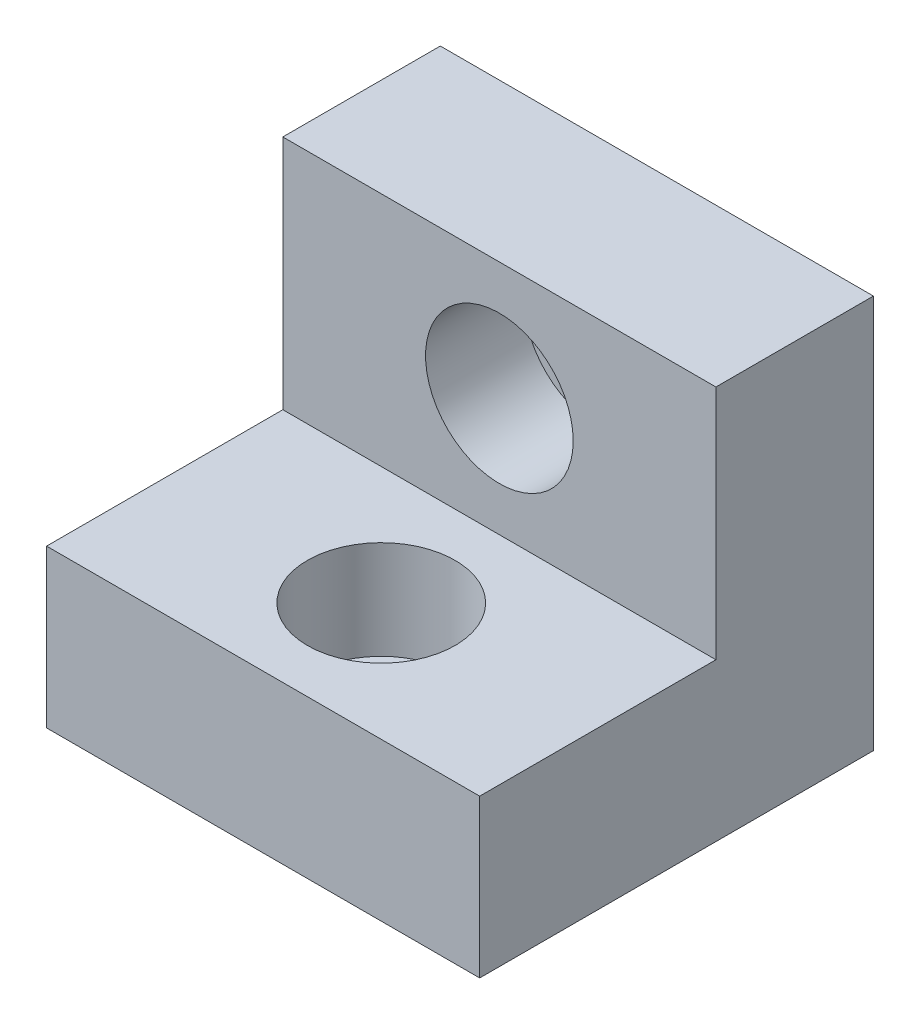
ISO-10303-21;
HEADER;
FILE_DESCRIPTION(('STEP AP214'),'2;1');
FILE_NAME('part.step','',(''),(''),'','','');
FILE_SCHEMA(('AUTOMOTIVE_DESIGN { 1 0 10303 214 1 1 1 1 }'));
ENDSEC;
DATA;
#1=APPLICATION_CONTEXT('core data for automotive mechanical design processes');
#2=APPLICATION_PROTOCOL_DEFINITION('international standard','automotive_design',2000,#1);
#3=PRODUCT_CONTEXT('',#1,'mechanical');
#4=PRODUCT('Part','Part','',(#3));
#5=PRODUCT_RELATED_PRODUCT_CATEGORY('part','',(#4));
#6=PRODUCT_DEFINITION_FORMATION('','',#4);
#7=PRODUCT_DEFINITION_CONTEXT('part definition',#1,'design');
#8=PRODUCT_DEFINITION('design','',#6,#7);
#9=PRODUCT_DEFINITION_SHAPE('','',#8);
#10=(LENGTH_UNIT() NAMED_UNIT(*) SI_UNIT(.MILLI.,.METRE.));
#11=(NAMED_UNIT(*) PLANE_ANGLE_UNIT() SI_UNIT($,.RADIAN.));
#12=(NAMED_UNIT(*) SI_UNIT($,.STERADIAN.) SOLID_ANGLE_UNIT());
#13=UNCERTAINTY_MEASURE_WITH_UNIT(LENGTH_MEASURE(1.E-05),#10,'distance_accuracy_value','');
#14=(GEOMETRIC_REPRESENTATION_CONTEXT(3) GLOBAL_UNCERTAINTY_ASSIGNED_CONTEXT((#13)) GLOBAL_UNIT_ASSIGNED_CONTEXT((#10,
#11,#12)) REPRESENTATION_CONTEXT('',''));
#15=CARTESIAN_POINT('',(0.,0.,0.));
#16=DIRECTION('',(0.,0.,1.));
#17=DIRECTION('',(1.,0.,0.));
#18=AXIS2_PLACEMENT_3D('',#15,#16,#17);
#19=CARTESIAN_POINT('',(22.,12.,0.));
#20=DIRECTION('',(0.,0.,-1.));
#21=DIRECTION('',(0.,1.,0.));
#22=AXIS2_PLACEMENT_3D('',#19,#20,#21);
#23=PLANE('',#22);
#24=CARTESIAN_POINT('',(11.,6.,0.));
#25=DIRECTION('',(0.,0.,1.));
#26=DIRECTION('',(1.,0.,0.));
#27=AXIS2_PLACEMENT_3D('',#24,#25,#26);
#28=CIRCLE('',#27,3.75);
#29=CARTESIAN_POINT('',(14.75,6.,0.));
#30=VERTEX_POINT('',#29);
#31=EDGE_CURVE('E164',#30,#30,#28,.T.);
#32=ORIENTED_EDGE('',*,*,#31,.F.);
#33=EDGE_LOOP('',(#32));
#34=FACE_BOUND('',#33,.T.);
#35=DIRECTION('',(0.,-1.,0.));
#36=VECTOR('',#35,1.);
#37=CARTESIAN_POINT('',(0.,12.,0.));
#38=LINE('',#37,#36);
#39=CARTESIAN_POINT('',(0.,12.,0.));
#40=VERTEX_POINT('',#39);
#41=CARTESIAN_POINT('',(0.,0.,0.));
#42=VERTEX_POINT('',#41);
#43=EDGE_CURVE('E136',#40,#42,#38,.T.);
#44=ORIENTED_EDGE('',*,*,#43,.T.);
#45=DIRECTION('',(-1.,0.,0.));
#46=VECTOR('',#45,1.);
#47=CARTESIAN_POINT('',(22.,0.,0.));
#48=LINE('',#47,#46);
#49=CARTESIAN_POINT('',(22.,0.,0.));
#50=VERTEX_POINT('',#49);
#51=EDGE_CURVE('E11',#50,#42,#48,.T.);
#52=ORIENTED_EDGE('',*,*,#51,.F.);
#53=DIRECTION('',(0.,-1.,0.));
#54=VECTOR('',#53,1.);
#55=CARTESIAN_POINT('',(22.,12.,0.));
#56=LINE('',#55,#54);
#57=CARTESIAN_POINT('',(22.,12.,0.));
#58=VERTEX_POINT('',#57);
#59=EDGE_CURVE('E155',#58,#50,#56,.T.);
#60=ORIENTED_EDGE('',*,*,#59,.F.);
#61=DIRECTION('',(-1.,0.,0.));
#62=VECTOR('',#61,1.);
#63=CARTESIAN_POINT('',(22.,12.,0.));
#64=LINE('',#63,#62);
#65=EDGE_CURVE('E134',#58,#40,#64,.T.);
#66=ORIENTED_EDGE('',*,*,#65,.T.);
#67=EDGE_LOOP('',(#44,#52,#60,#66));
#68=FACE_BOUND('',#67,.T.);
#69=ADVANCED_FACE('F44',(#34,#68),#23,.F.);
#70=CARTESIAN_POINT('',(22.,0.,0.));
#71=DIRECTION('',(0.,-1.,0.));
#72=DIRECTION('',(0.,0.,-1.));
#73=AXIS2_PLACEMENT_3D('',#70,#71,#72);
#74=PLANE('',#73);
#75=CARTESIAN_POINT('',(11.,0.,6.));
#76=DIRECTION('',(0.,1.,0.));
#77=DIRECTION('',(0.,0.,1.));
#78=AXIS2_PLACEMENT_3D('',#75,#76,#77);
#79=CIRCLE('',#78,3.75);
#80=CARTESIAN_POINT('',(11.,0.,9.75));
#81=VERTEX_POINT('',#80);
#82=EDGE_CURVE('E179',#81,#81,#79,.T.);
#83=ORIENTED_EDGE('',*,*,#82,.F.);
#84=EDGE_LOOP('',(#83));
#85=FACE_BOUND('',#84,.T.);
#86=DIRECTION('',(0.,0.,1.));
#87=VECTOR('',#86,1.);
#88=CARTESIAN_POINT('',(0.,0.,0.));
#89=LINE('',#88,#87);
#90=CARTESIAN_POINT('',(0.,0.,12.));
#91=VERTEX_POINT('',#90);
#92=EDGE_CURVE('E139',#42,#91,#89,.T.);
#93=ORIENTED_EDGE('',*,*,#92,.T.);
#94=DIRECTION('',(-1.,0.,0.));
#95=VECTOR('',#94,1.);
#96=CARTESIAN_POINT('',(22.,0.,12.));
#97=LINE('',#96,#95);
#98=CARTESIAN_POINT('',(22.,0.,12.));
#99=VERTEX_POINT('',#98);
#100=EDGE_CURVE('E54',#99,#91,#97,.T.);
#101=ORIENTED_EDGE('',*,*,#100,.F.);
#102=DIRECTION('',(0.,0.,1.));
#103=VECTOR('',#102,1.);
#104=CARTESIAN_POINT('',(22.,0.,0.));
#105=LINE('',#104,#103);
#106=EDGE_CURVE('E103',#50,#99,#105,.T.);
#107=ORIENTED_EDGE('',*,*,#106,.F.);
#108=ORIENTED_EDGE('',*,*,#51,.T.);
#109=EDGE_LOOP('',(#93,#101,#107,#108));
#110=FACE_BOUND('',#109,.T.);
#111=ADVANCED_FACE('F195',(#85,#110),#74,.F.);
#112=CARTESIAN_POINT('',(22.,0.,12.));
#113=DIRECTION('',(0.,0.,-1.));
#114=DIRECTION('',(-1.,0.,0.));
#115=AXIS2_PLACEMENT_3D('',#112,#113,#114);
#116=PLANE('',#115);
#117=DIRECTION('',(0.,-1.,0.));
#118=VECTOR('',#117,1.);
#119=CARTESIAN_POINT('',(0.,0.,12.));
#120=LINE('',#119,#118);
#121=CARTESIAN_POINT('',(0.,-8.00000000000001,12.));
#122=VERTEX_POINT('',#121);
#123=EDGE_CURVE('E144',#91,#122,#120,.T.);
#124=ORIENTED_EDGE('',*,*,#123,.T.);
#125=DIRECTION('',(-1.,0.,0.));
#126=VECTOR('',#125,1.);
#127=CARTESIAN_POINT('',(22.,-8.00000000000001,12.));
#128=LINE('',#127,#126);
#129=CARTESIAN_POINT('',(22.,-8.00000000000001,12.));
#130=VERTEX_POINT('',#129);
#131=EDGE_CURVE('E123',#130,#122,#128,.T.);
#132=ORIENTED_EDGE('',*,*,#131,.F.);
#133=DIRECTION('',(0.,-1.,0.));
#134=VECTOR('',#133,1.);
#135=CARTESIAN_POINT('',(22.,0.,12.));
#136=LINE('',#135,#134);
#137=EDGE_CURVE('E112',#99,#130,#136,.T.);
#138=ORIENTED_EDGE('',*,*,#137,.F.);
#139=ORIENTED_EDGE('',*,*,#100,.T.);
#140=EDGE_LOOP('',(#124,#132,#138,#139));
#141=FACE_BOUND('',#140,.T.);
#142=ADVANCED_FACE('F197',(#141),#116,.F.);
#143=CARTESIAN_POINT('',(22.,-8.00000000000001,12.));
#144=DIRECTION('',(0.,1.,0.));
#145=DIRECTION('',(0.,0.,1.));
#146=AXIS2_PLACEMENT_3D('',#143,#144,#145);
#147=PLANE('',#146);
#148=CARTESIAN_POINT('',(11.,-8.00000000000001,6.));
#149=DIRECTION('',(0.,1.,0.));
#150=DIRECTION('',(0.,0.,1.));
#151=AXIS2_PLACEMENT_3D('',#148,#149,#150);
#152=CIRCLE('',#151,2.4);
#153=CARTESIAN_POINT('',(11.,-8.00000000000001,8.4));
#154=VERTEX_POINT('',#153);
#155=EDGE_CURVE('E48',#154,#154,#152,.T.);
#156=ORIENTED_EDGE('',*,*,#155,.T.);
#157=EDGE_LOOP('',(#156));
#158=FACE_BOUND('',#157,.T.);
#159=DIRECTION('',(0.,0.,-1.));
#160=VECTOR('',#159,1.);
#161=CARTESIAN_POINT('',(0.,-8.00000000000001,12.));
#162=LINE('',#161,#160);
#163=CARTESIAN_POINT('',(0.,-8.00000000000001,-7.99999999999999));
#164=VERTEX_POINT('',#163);
#165=EDGE_CURVE('E124',#122,#164,#162,.T.);
#166=ORIENTED_EDGE('',*,*,#165,.T.);
#167=DIRECTION('',(-1.,0.,0.));
#168=VECTOR('',#167,1.);
#169=CARTESIAN_POINT('',(22.,-8.00000000000001,-7.99999999999999));
#170=LINE('',#169,#168);
#171=CARTESIAN_POINT('',(22.,-8.00000000000001,-7.99999999999999));
#172=VERTEX_POINT('',#171);
#173=EDGE_CURVE('E119',#172,#164,#170,.T.);
#174=ORIENTED_EDGE('',*,*,#173,.F.);
#175=DIRECTION('',(0.,0.,-1.));
#176=VECTOR('',#175,1.);
#177=CARTESIAN_POINT('',(22.,-8.00000000000001,12.));
#178=LINE('',#177,#176);
#179=EDGE_CURVE('E108',#130,#172,#178,.T.);
#180=ORIENTED_EDGE('',*,*,#179,.F.);
#181=ORIENTED_EDGE('',*,*,#131,.T.);
#182=EDGE_LOOP('',(#166,#174,#180,#181));
#183=FACE_BOUND('',#182,.T.);
#184=ADVANCED_FACE('F122',(#158,#183),#147,.F.);
#185=CARTESIAN_POINT('',(22.,-8.00000000000001,-7.99999999999999));
#186=DIRECTION('',(0.,0.,1.));
#187=DIRECTION('',(0.,-1.,0.));
#188=AXIS2_PLACEMENT_3D('',#185,#186,#187);
#189=PLANE('',#188);
#190=CARTESIAN_POINT('',(11.,6.,-7.99999999999999));
#191=DIRECTION('',(0.,0.,1.));
#192=DIRECTION('',(0.,-1.,0.));
#193=AXIS2_PLACEMENT_3D('',#190,#191,#192);
#194=CIRCLE('',#193,2.4);
#195=CARTESIAN_POINT('',(11.,3.6,-7.99999999999999));
#196=VERTEX_POINT('',#195);
#197=EDGE_CURVE('E162',#196,#196,#194,.T.);
#198=ORIENTED_EDGE('',*,*,#197,.T.);
#199=EDGE_LOOP('',(#198));
#200=FACE_BOUND('',#199,.T.);
#201=DIRECTION('',(0.,1.,0.));
#202=VECTOR('',#201,1.);
#203=CARTESIAN_POINT('',(0.,-8.00000000000001,-7.99999999999999));
#204=LINE('',#203,#202);
#205=CARTESIAN_POINT('',(0.,12.,-7.99999999999999));
#206=VERTEX_POINT('',#205);
#207=EDGE_CURVE('E89',#164,#206,#204,.T.);
#208=ORIENTED_EDGE('',*,*,#207,.T.);
#209=DIRECTION('',(-1.,0.,0.));
#210=VECTOR('',#209,1.);
#211=CARTESIAN_POINT('',(22.,12.,-7.99999999999999));
#212=LINE('',#211,#210);
#213=CARTESIAN_POINT('',(22.,12.,-7.99999999999999));
#214=VERTEX_POINT('',#213);
#215=EDGE_CURVE('E129',#214,#206,#212,.T.);
#216=ORIENTED_EDGE('',*,*,#215,.F.);
#217=DIRECTION('',(0.,1.,0.));
#218=VECTOR('',#217,1.);
#219=CARTESIAN_POINT('',(22.,-8.00000000000001,-7.99999999999999));
#220=LINE('',#219,#218);
#221=EDGE_CURVE('E115',#172,#214,#220,.T.);
#222=ORIENTED_EDGE('',*,*,#221,.F.);
#223=ORIENTED_EDGE('',*,*,#173,.T.);
#224=EDGE_LOOP('',(#208,#216,#222,#223));
#225=FACE_BOUND('',#224,.T.);
#226=ADVANCED_FACE('F130',(#200,#225),#189,.F.);
#227=CARTESIAN_POINT('',(22.,12.,-7.99999999999999));
#228=DIRECTION('',(0.,-1.,0.));
#229=DIRECTION('',(0.,0.,-1.));
#230=AXIS2_PLACEMENT_3D('',#227,#228,#229);
#231=PLANE('',#230);
#232=DIRECTION('',(0.,0.,1.));
#233=VECTOR('',#232,1.);
#234=CARTESIAN_POINT('',(0.,12.,-7.99999999999999));
#235=LINE('',#234,#233);
#236=EDGE_CURVE('E92',#206,#40,#235,.T.);
#237=ORIENTED_EDGE('',*,*,#236,.T.);
#238=ORIENTED_EDGE('',*,*,#65,.F.);
#239=DIRECTION('',(0.,0.,1.));
#240=VECTOR('',#239,1.);
#241=CARTESIAN_POINT('',(22.,12.,-7.99999999999999));
#242=LINE('',#241,#240);
#243=EDGE_CURVE('E63',#214,#58,#242,.T.);
#244=ORIENTED_EDGE('',*,*,#243,.F.);
#245=ORIENTED_EDGE('',*,*,#215,.T.);
#246=EDGE_LOOP('',(#237,#238,#244,#245));
#247=FACE_BOUND('',#246,.T.);
#248=ADVANCED_FACE('F201',(#247),#231,.F.);
#249=CARTESIAN_POINT('',(22.,0.,0.));
#250=DIRECTION('',(-1.,0.,0.));
#251=DIRECTION('',(0.,0.,1.));
#252=AXIS2_PLACEMENT_3D('',#249,#250,#251);
#253=PLANE('',#252);
#254=ORIENTED_EDGE('',*,*,#59,.T.);
#255=ORIENTED_EDGE('',*,*,#106,.T.);
#256=ORIENTED_EDGE('',*,*,#137,.T.);
#257=ORIENTED_EDGE('',*,*,#179,.T.);
#258=ORIENTED_EDGE('',*,*,#221,.T.);
#259=ORIENTED_EDGE('',*,*,#243,.T.);
#260=EDGE_LOOP('',(#254,#255,#256,#257,#258,#259));
#261=FACE_BOUND('',#260,.T.);
#262=ADVANCED_FACE('F109',(#261),#253,.F.);
#263=CARTESIAN_POINT('',(0.,0.,0.));
#264=DIRECTION('',(-1.,0.,0.));
#265=DIRECTION('',(0.,0.,1.));
#266=AXIS2_PLACEMENT_3D('',#263,#264,#265);
#267=PLANE('',#266);
#268=ORIENTED_EDGE('',*,*,#43,.F.);
#269=ORIENTED_EDGE('',*,*,#236,.F.);
#270=ORIENTED_EDGE('',*,*,#207,.F.);
#271=ORIENTED_EDGE('',*,*,#165,.F.);
#272=ORIENTED_EDGE('',*,*,#123,.F.);
#273=ORIENTED_EDGE('',*,*,#92,.F.);
#274=EDGE_LOOP('',(#268,#269,#270,#271,#272,#273));
#275=FACE_BOUND('',#274,.T.);
#276=ADVANCED_FACE('F196',(#275),#267,.T.);
#277=CARTESIAN_POINT('',(11.,6.,-5.));
#278=DIRECTION('',(0.,0.,1.));
#279=DIRECTION('',(1.,0.,0.));
#280=AXIS2_PLACEMENT_3D('',#277,#278,#279);
#281=CYLINDRICAL_SURFACE('',#280,3.75);
#282=CARTESIAN_POINT('',(11.,6.,-5.));
#283=DIRECTION('',(0.,0.,1.));
#284=DIRECTION('',(1.,0.,0.));
#285=AXIS2_PLACEMENT_3D('',#282,#283,#284);
#286=CIRCLE('',#285,3.75);
#287=CARTESIAN_POINT('',(14.75,6.,-5.));
#288=VERTEX_POINT('',#287);
#289=EDGE_CURVE('E142',#288,#288,#286,.T.);
#290=ORIENTED_EDGE('',*,*,#289,.F.);
#291=EDGE_LOOP('',(#290));
#292=FACE_BOUND('',#291,.T.);
#293=ORIENTED_EDGE('',*,*,#31,.T.);
#294=EDGE_LOOP('',(#293));
#295=FACE_BOUND('',#294,.T.);
#296=ADVANCED_FACE('F225',(#292,#295),#281,.F.);
#297=CARTESIAN_POINT('',(11.,6.,-5.));
#298=DIRECTION('',(0.,0.,1.));
#299=DIRECTION('',(1.,0.,0.));
#300=AXIS2_PLACEMENT_3D('',#297,#298,#299);
#301=PLANE('',#300);
#302=CARTESIAN_POINT('',(11.,6.,-5.));
#303=DIRECTION('',(0.,0.,1.));
#304=DIRECTION('',(1.,0.,0.));
#305=AXIS2_PLACEMENT_3D('',#302,#303,#304);
#306=CIRCLE('',#305,2.4);
#307=CARTESIAN_POINT('',(13.4,6.,-5.));
#308=VERTEX_POINT('',#307);
#309=EDGE_CURVE('E168',#308,#308,#306,.T.);
#310=ORIENTED_EDGE('',*,*,#309,.F.);
#311=EDGE_LOOP('',(#310));
#312=FACE_BOUND('',#311,.T.);
#313=ORIENTED_EDGE('',*,*,#289,.T.);
#314=EDGE_LOOP('',(#313));
#315=FACE_BOUND('',#314,.T.);
#316=ADVANCED_FACE('F222',(#312,#315),#301,.T.);
#317=CARTESIAN_POINT('',(11.,6.,-10.));
#318=DIRECTION('',(0.,0.,1.));
#319=DIRECTION('',(1.,0.,0.));
#320=AXIS2_PLACEMENT_3D('',#317,#318,#319);
#321=CYLINDRICAL_SURFACE('',#320,2.4);
#322=ORIENTED_EDGE('',*,*,#309,.T.);
#323=EDGE_LOOP('',(#322));
#324=FACE_BOUND('',#323,.T.);
#325=ORIENTED_EDGE('',*,*,#197,.F.);
#326=EDGE_LOOP('',(#325));
#327=FACE_BOUND('',#326,.T.);
#328=ADVANCED_FACE('F230',(#324,#327),#321,.F.);
#329=CARTESIAN_POINT('',(11.,-5.,6.));
#330=DIRECTION('',(0.,1.,0.));
#331=DIRECTION('',(0.,0.,1.));
#332=AXIS2_PLACEMENT_3D('',#329,#330,#331);
#333=CYLINDRICAL_SURFACE('',#332,3.75);
#334=CARTESIAN_POINT('',(11.,-5.,6.));
#335=DIRECTION('',(0.,1.,0.));
#336=DIRECTION('',(0.,0.,1.));
#337=AXIS2_PLACEMENT_3D('',#334,#335,#336);
#338=CIRCLE('',#337,3.75);
#339=CARTESIAN_POINT('',(11.,-5.,9.75));
#340=VERTEX_POINT('',#339);
#341=EDGE_CURVE('E172',#340,#340,#338,.T.);
#342=ORIENTED_EDGE('',*,*,#341,.F.);
#343=EDGE_LOOP('',(#342));
#344=FACE_BOUND('',#343,.T.);
#345=ORIENTED_EDGE('',*,*,#82,.T.);
#346=EDGE_LOOP('',(#345));
#347=FACE_BOUND('',#346,.T.);
#348=ADVANCED_FACE('F236',(#344,#347),#333,.F.);
#349=CARTESIAN_POINT('',(11.,-5.,6.));
#350=DIRECTION('',(0.,1.,0.));
#351=DIRECTION('',(0.,0.,1.));
#352=AXIS2_PLACEMENT_3D('',#349,#350,#351);
#353=PLANE('',#352);
#354=CARTESIAN_POINT('',(11.,-5.,6.));
#355=DIRECTION('',(0.,1.,0.));
#356=DIRECTION('',(0.,0.,1.));
#357=AXIS2_PLACEMENT_3D('',#354,#355,#356);
#358=CIRCLE('',#357,2.4);
#359=CARTESIAN_POINT('',(11.,-5.,8.4));
#360=VERTEX_POINT('',#359);
#361=EDGE_CURVE('E255',#360,#360,#358,.T.);
#362=ORIENTED_EDGE('',*,*,#361,.F.);
#363=EDGE_LOOP('',(#362));
#364=FACE_BOUND('',#363,.T.);
#365=ORIENTED_EDGE('',*,*,#341,.T.);
#366=EDGE_LOOP('',(#365));
#367=FACE_BOUND('',#366,.T.);
#368=ADVANCED_FACE('F237',(#364,#367),#353,.T.);
#369=CARTESIAN_POINT('',(11.,-10.,6.));
#370=DIRECTION('',(0.,1.,0.));
#371=DIRECTION('',(0.,0.,1.));
#372=AXIS2_PLACEMENT_3D('',#369,#370,#371);
#373=CYLINDRICAL_SURFACE('',#372,2.4);
#374=ORIENTED_EDGE('',*,*,#361,.T.);
#375=EDGE_LOOP('',(#374));
#376=FACE_BOUND('',#375,.T.);
#377=ORIENTED_EDGE('',*,*,#155,.F.);
#378=EDGE_LOOP('',(#377));
#379=FACE_BOUND('',#378,.T.);
#380=ADVANCED_FACE('F243',(#376,#379),#373,.F.);
#381=CLOSED_SHELL('',(#69,#111,#142,#184,#226,#248,#262,#276,#296,#316,#328,#348,#368,#380));
#382=MANIFOLD_SOLID_BREP('B2',#381);
#383=ADVANCED_BREP_SHAPE_REPRESENTATION('',(#18,#382),#14);
#384=SHAPE_DEFINITION_REPRESENTATION(#9,#383);
ENDSEC;
END-ISO-10303-21;
